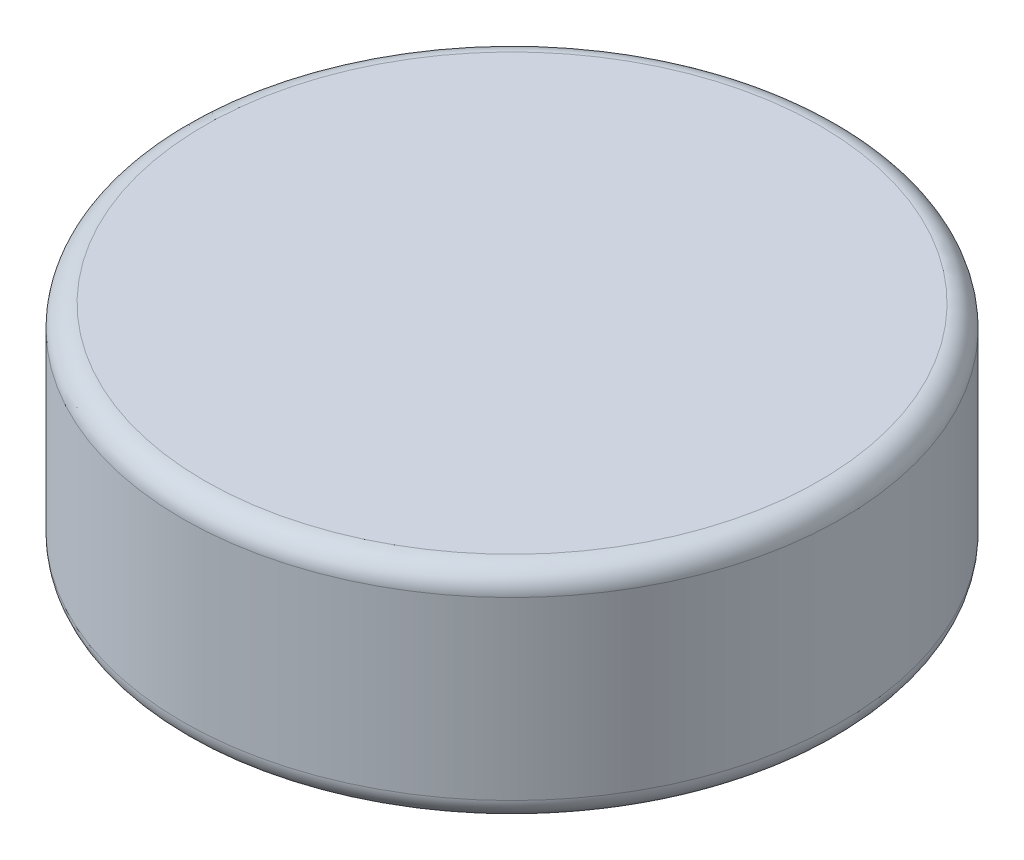
ISO-10303-21;
HEADER;
FILE_DESCRIPTION(('STEP AP214'),'2;1');
FILE_NAME('part.step','',(''),(''),'','','');
FILE_SCHEMA(('AUTOMOTIVE_DESIGN { 1 0 10303 214 1 1 1 1 }'));
ENDSEC;
DATA;
#1=APPLICATION_CONTEXT('core data for automotive mechanical design processes');
#2=APPLICATION_PROTOCOL_DEFINITION('international standard','automotive_design',2000,#1);
#3=PRODUCT_CONTEXT('',#1,'mechanical');
#4=PRODUCT('Part','Part','',(#3));
#5=PRODUCT_RELATED_PRODUCT_CATEGORY('part','',(#4));
#6=PRODUCT_DEFINITION_FORMATION('','',#4);
#7=PRODUCT_DEFINITION_CONTEXT('part definition',#1,'design');
#8=PRODUCT_DEFINITION('design','',#6,#7);
#9=PRODUCT_DEFINITION_SHAPE('','',#8);
#10=(LENGTH_UNIT() NAMED_UNIT(*) SI_UNIT(.MILLI.,.METRE.));
#11=(NAMED_UNIT(*) PLANE_ANGLE_UNIT() SI_UNIT($,.RADIAN.));
#12=(NAMED_UNIT(*) SI_UNIT($,.STERADIAN.) SOLID_ANGLE_UNIT());
#13=UNCERTAINTY_MEASURE_WITH_UNIT(LENGTH_MEASURE(1.E-05),#10,'distance_accuracy_value','');
#14=(GEOMETRIC_REPRESENTATION_CONTEXT(3) GLOBAL_UNCERTAINTY_ASSIGNED_CONTEXT((#13)) GLOBAL_UNIT_ASSIGNED_CONTEXT((#10,
#11,#12)) REPRESENTATION_CONTEXT('',''));
#15=CARTESIAN_POINT('',(0.,0.,0.));
#16=DIRECTION('',(0.,0.,1.));
#17=DIRECTION('',(1.,0.,0.));
#18=AXIS2_PLACEMENT_3D('',#15,#16,#17);
#19=CARTESIAN_POINT('',(0.,1.,0.));
#20=DIRECTION('',(0.,-1.,0.));
#21=DIRECTION('',(0.,0.,-1.));
#22=AXIS2_PLACEMENT_3D('',#19,#20,#21);
#23=CYLINDRICAL_SURFACE('',#22,1.5);
#24=CARTESIAN_POINT('',(0.,0.1,0.));
#25=DIRECTION('',(0.,1.,0.));
#26=DIRECTION('',(0.,0.,1.));
#27=AXIS2_PLACEMENT_3D('',#24,#25,#26);
#28=CIRCLE('',#27,1.5);
#29=CARTESIAN_POINT('',(0.,0.1,1.5));
#30=VERTEX_POINT('',#29);
#31=EDGE_CURVE('E42',#30,#30,#28,.T.);
#32=ORIENTED_EDGE('',*,*,#31,.T.);
#33=EDGE_LOOP('',(#32));
#34=FACE_BOUND('',#33,.T.);
#35=CARTESIAN_POINT('',(0.,0.9,0.));
#36=DIRECTION('',(0.,1.,0.));
#37=DIRECTION('',(0.,0.,1.));
#38=AXIS2_PLACEMENT_3D('',#35,#36,#37);
#39=CIRCLE('',#38,1.5);
#40=CARTESIAN_POINT('',(0.,0.9,1.5));
#41=VERTEX_POINT('',#40);
#42=EDGE_CURVE('E46',#41,#41,#39,.F.);
#43=ORIENTED_EDGE('',*,*,#42,.T.);
#44=EDGE_LOOP('',(#43));
#45=FACE_BOUND('',#44,.T.);
#46=ADVANCED_FACE('F31',(#34,#45),#23,.T.);
#47=CARTESIAN_POINT('',(0.,1.,0.));
#48=DIRECTION('',(0.,1.,0.));
#49=DIRECTION('',(0.,0.,1.));
#50=AXIS2_PLACEMENT_3D('',#47,#48,#49);
#51=PLANE('',#50);
#52=CARTESIAN_POINT('',(0.,1.,0.));
#53=DIRECTION('',(0.,1.,0.));
#54=DIRECTION('',(0.,0.,1.));
#55=AXIS2_PLACEMENT_3D('',#52,#53,#54);
#56=CIRCLE('',#55,1.4);
#57=CARTESIAN_POINT('',(0.,1.,1.4));
#58=VERTEX_POINT('',#57);
#59=EDGE_CURVE('E10',#58,#58,#56,.T.);
#60=ORIENTED_EDGE('',*,*,#59,.T.);
#61=EDGE_LOOP('',(#60));
#62=FACE_BOUND('',#61,.T.);
#63=ADVANCED_FACE('F62',(#62),#51,.T.);
#64=CARTESIAN_POINT('',(0.,0.,0.));
#65=DIRECTION('',(0.,1.,0.));
#66=DIRECTION('',(0.,0.,1.));
#67=AXIS2_PLACEMENT_3D('',#64,#65,#66);
#68=PLANE('',#67);
#69=CARTESIAN_POINT('',(0.,0.,0.));
#70=DIRECTION('',(0.,1.,0.));
#71=DIRECTION('',(0.,0.,1.));
#72=AXIS2_PLACEMENT_3D('',#69,#70,#71);
#73=CIRCLE('',#72,1.4);
#74=CARTESIAN_POINT('',(0.,0.,1.4));
#75=VERTEX_POINT('',#74);
#76=EDGE_CURVE('E38',#75,#75,#73,.F.);
#77=ORIENTED_EDGE('',*,*,#76,.T.);
#78=EDGE_LOOP('',(#77));
#79=FACE_BOUND('',#78,.T.);
#80=ADVANCED_FACE('F59',(#79),#68,.F.);
#81=CARTESIAN_POINT('',(0.,0.1,0.));
#82=DIRECTION('',(0.,1.,0.));
#83=DIRECTION('',(0.,0.,1.));
#84=AXIS2_PLACEMENT_3D('',#81,#82,#83);
#85=TOROIDAL_SURFACE('',#84,1.4,0.1);
#86=ORIENTED_EDGE('',*,*,#76,.F.);
#87=EDGE_LOOP('',(#86));
#88=FACE_BOUND('',#87,.T.);
#89=ORIENTED_EDGE('',*,*,#31,.F.);
#90=EDGE_LOOP('',(#89));
#91=FACE_BOUND('',#90,.T.);
#92=ADVANCED_FACE('F55',(#88,#91),#85,.T.);
#93=CARTESIAN_POINT('',(0.,0.9,0.));
#94=DIRECTION('',(0.,1.,0.));
#95=DIRECTION('',(0.,0.,1.));
#96=AXIS2_PLACEMENT_3D('',#93,#94,#95);
#97=TOROIDAL_SURFACE('',#96,1.4,0.1);
#98=ORIENTED_EDGE('',*,*,#42,.F.);
#99=EDGE_LOOP('',(#98));
#100=FACE_BOUND('',#99,.T.);
#101=ORIENTED_EDGE('',*,*,#59,.F.);
#102=EDGE_LOOP('',(#101));
#103=FACE_BOUND('',#102,.T.);
#104=ADVANCED_FACE('F33',(#100,#103),#97,.T.);
#105=CLOSED_SHELL('',(#46,#63,#80,#92,#104));
#106=MANIFOLD_SOLID_BREP('B2',#105);
#107=ADVANCED_BREP_SHAPE_REPRESENTATION('',(#18,#106),#14);
#108=SHAPE_DEFINITION_REPRESENTATION(#9,#107);
ENDSEC;
END-ISO-10303-21;
